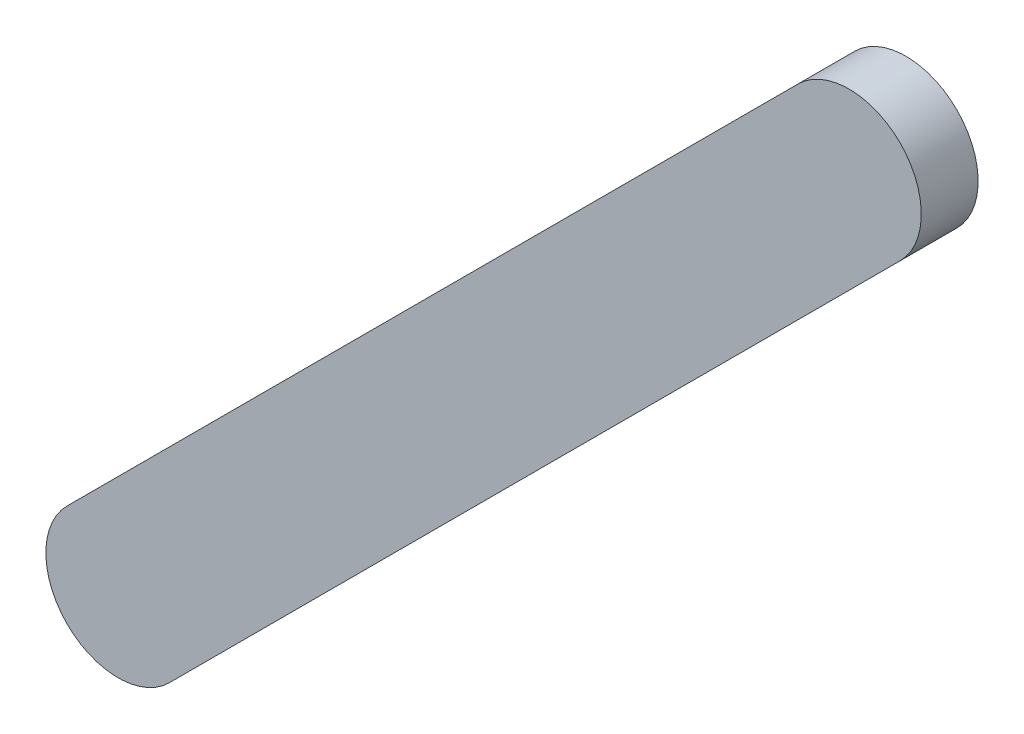
ISO-10303-21;
HEADER;
FILE_DESCRIPTION(('STEP AP214'),'2;1');
FILE_NAME('part.step','',(''),(''),'','','');
FILE_SCHEMA(('AUTOMOTIVE_DESIGN { 1 0 10303 214 1 1 1 1 }'));
ENDSEC;
DATA;
#1=APPLICATION_CONTEXT('core data for automotive mechanical design processes');
#2=APPLICATION_PROTOCOL_DEFINITION('international standard','automotive_design',2000,#1);
#3=PRODUCT_CONTEXT('',#1,'mechanical');
#4=PRODUCT('Part','Part','',(#3));
#5=PRODUCT_RELATED_PRODUCT_CATEGORY('part','',(#4));
#6=PRODUCT_DEFINITION_FORMATION('','',#4);
#7=PRODUCT_DEFINITION_CONTEXT('part definition',#1,'design');
#8=PRODUCT_DEFINITION('design','',#6,#7);
#9=PRODUCT_DEFINITION_SHAPE('','',#8);
#10=(LENGTH_UNIT() NAMED_UNIT(*) SI_UNIT(.MILLI.,.METRE.));
#11=(NAMED_UNIT(*) PLANE_ANGLE_UNIT() SI_UNIT($,.RADIAN.));
#12=(NAMED_UNIT(*) SI_UNIT($,.STERADIAN.) SOLID_ANGLE_UNIT());
#13=UNCERTAINTY_MEASURE_WITH_UNIT(LENGTH_MEASURE(1.E-05),#10,'distance_accuracy_value','');
#14=(GEOMETRIC_REPRESENTATION_CONTEXT(3) GLOBAL_UNCERTAINTY_ASSIGNED_CONTEXT((#13)) GLOBAL_UNIT_ASSIGNED_CONTEXT((#10,
#11,#12)) REPRESENTATION_CONTEXT('',''));
#15=CARTESIAN_POINT('',(0.,0.,0.));
#16=DIRECTION('',(0.,0.,1.));
#17=DIRECTION('',(1.,0.,0.));
#18=AXIS2_PLACEMENT_3D('',#15,#16,#17);
#19=CARTESIAN_POINT('',(139.59405914,83.12939686,0.));
#20=DIRECTION('',(-0.707106781186554,0.707106781186542,0.));
#21=DIRECTION('',(0.707106781186542,0.707106781186554,0.));
#22=AXIS2_PLACEMENT_3D('',#19,#20,#21);
#23=PLANE('',#22);
#24=DIRECTION('',(0.707106781186542,0.707106781186553,0.));
#25=VECTOR('',#24,1.);
#26=CARTESIAN_POINT('',(139.59405914,83.12939686,0.1999996));
#27=LINE('',#26,#25);
#28=CARTESIAN_POINT('',(139.59405914,83.12939686,0.1999996));
#29=VERTEX_POINT('',#28);
#30=CARTESIAN_POINT('',(142.16560594,85.70094366,0.1999996));
#31=VERTEX_POINT('',#30);
#32=EDGE_CURVE('E11',#29,#31,#27,.T.);
#33=ORIENTED_EDGE('',*,*,#32,.F.);
#34=DIRECTION('',(0.,0.,1.));
#35=VECTOR('',#34,1.);
#36=CARTESIAN_POINT('',(139.59405914,83.12939686,0.));
#37=LINE('',#36,#35);
#38=CARTESIAN_POINT('',(139.59405914,83.12939686,0.));
#39=VERTEX_POINT('',#38);
#40=EDGE_CURVE('E24',#39,#29,#37,.T.);
#41=ORIENTED_EDGE('',*,*,#40,.F.);
#42=DIRECTION('',(0.707106781186542,0.707106781186553,0.));
#43=VECTOR('',#42,1.);
#44=CARTESIAN_POINT('',(139.59405914,83.12939686,0.));
#45=LINE('',#44,#43);
#46=CARTESIAN_POINT('',(142.16560594,85.70094366,0.));
#47=VERTEX_POINT('',#46);
#48=EDGE_CURVE('E75',#39,#47,#45,.T.);
#49=ORIENTED_EDGE('',*,*,#48,.T.);
#50=DIRECTION('',(0.,0.,1.));
#51=VECTOR('',#50,1.);
#52=CARTESIAN_POINT('',(142.16560594,85.70094366,0.));
#53=LINE('',#52,#51);
#54=EDGE_CURVE('E37',#47,#31,#53,.T.);
#55=ORIENTED_EDGE('',*,*,#54,.T.);
#56=EDGE_LOOP('',(#33,#41,#49,#55));
#57=FACE_BOUND('',#56,.T.);
#58=ADVANCED_FACE('F17',(#57),#23,.F.);
#59=CARTESIAN_POINT('',(141.986,85.8805496,0.));
#60=DIRECTION('',(0.,0.,-1.));
#61=DIRECTION('',(0.707106781186548,-0.707106781186548,0.));
#62=AXIS2_PLACEMENT_3D('',#59,#60,#61);
#63=CYLINDRICAL_SURFACE('',#62,0.254001156230764);
#64=CARTESIAN_POINT('',(141.986,85.8805496,0.1999996));
#65=DIRECTION('',(0.,0.,1.));
#66=DIRECTION('',(0.707106781186548,-0.707106781186548,0.));
#67=AXIS2_PLACEMENT_3D('',#64,#65,#66);
#68=CIRCLE('',#67,0.254001156230764);
#69=CARTESIAN_POINT('',(141.80639406,86.06015554,0.1999996));
#70=VERTEX_POINT('',#69);
#71=EDGE_CURVE('E83',#31,#70,#68,.T.);
#72=ORIENTED_EDGE('',*,*,#71,.F.);
#73=ORIENTED_EDGE('',*,*,#54,.F.);
#74=CARTESIAN_POINT('',(141.986,85.8805496,0.));
#75=DIRECTION('',(0.,0.,1.));
#76=DIRECTION('',(0.707106781186548,-0.707106781186548,0.));
#77=AXIS2_PLACEMENT_3D('',#74,#75,#76);
#78=CIRCLE('',#77,0.254001156230764);
#79=CARTESIAN_POINT('',(141.80639406,86.06015554,0.));
#80=VERTEX_POINT('',#79);
#81=EDGE_CURVE('E81',#47,#80,#78,.T.);
#82=ORIENTED_EDGE('',*,*,#81,.T.);
#83=DIRECTION('',(0.,0.,1.));
#84=VECTOR('',#83,1.);
#85=CARTESIAN_POINT('',(141.80639406,86.06015554,0.));
#86=LINE('',#85,#84);
#87=EDGE_CURVE('E67',#80,#70,#86,.T.);
#88=ORIENTED_EDGE('',*,*,#87,.T.);
#89=EDGE_LOOP('',(#72,#73,#82,#88));
#90=FACE_BOUND('',#89,.T.);
#91=ADVANCED_FACE('F89',(#90),#63,.T.);
#92=CARTESIAN_POINT('',(141.80639406,86.06015554,0.));
#93=DIRECTION('',(0.707106781186554,-0.707106781186542,0.));
#94=DIRECTION('',(-0.707106781186542,-0.707106781186554,0.));
#95=AXIS2_PLACEMENT_3D('',#92,#93,#94);
#96=PLANE('',#95);
#97=DIRECTION('',(-0.707106781186542,-0.707106781186553,0.));
#98=VECTOR('',#97,1.);
#99=CARTESIAN_POINT('',(141.80639406,86.06015554,0.1999996));
#100=LINE('',#99,#98);
#101=CARTESIAN_POINT('',(139.23484726,83.48860874,0.1999996));
#102=VERTEX_POINT('',#101);
#103=EDGE_CURVE('E71',#70,#102,#100,.T.);
#104=ORIENTED_EDGE('',*,*,#103,.F.);
#105=ORIENTED_EDGE('',*,*,#87,.F.);
#106=DIRECTION('',(-0.707106781186542,-0.707106781186553,0.));
#107=VECTOR('',#106,1.);
#108=CARTESIAN_POINT('',(141.80639406,86.06015554,0.));
#109=LINE('',#108,#107);
#110=CARTESIAN_POINT('',(139.23484726,83.48860874,0.));
#111=VERTEX_POINT('',#110);
#112=EDGE_CURVE('E63',#80,#111,#109,.T.);
#113=ORIENTED_EDGE('',*,*,#112,.T.);
#114=DIRECTION('',(0.,0.,1.));
#115=VECTOR('',#114,1.);
#116=CARTESIAN_POINT('',(139.23484726,83.48860874,0.));
#117=LINE('',#116,#115);
#118=EDGE_CURVE('E53',#111,#102,#117,.T.);
#119=ORIENTED_EDGE('',*,*,#118,.T.);
#120=EDGE_LOOP('',(#104,#105,#113,#119));
#121=FACE_BOUND('',#120,.T.);
#122=ADVANCED_FACE('F66',(#121),#96,.F.);
#123=CARTESIAN_POINT('',(139.4144532,83.3090028,0.));
#124=DIRECTION('',(0.,0.,-1.));
#125=DIRECTION('',(-0.707106781186604,0.707106781186492,0.));
#126=AXIS2_PLACEMENT_3D('',#123,#124,#125);
#127=CYLINDRICAL_SURFACE('',#126,0.254001156230771);
#128=CARTESIAN_POINT('',(139.4144532,83.3090028,0.1999996));
#129=DIRECTION('',(0.,0.,1.));
#130=DIRECTION('',(-0.707106781186604,0.707106781186492,0.));
#131=AXIS2_PLACEMENT_3D('',#128,#129,#130);
#132=CIRCLE('',#131,0.254001156230771);
#133=EDGE_CURVE('E59',#102,#29,#132,.T.);
#134=ORIENTED_EDGE('',*,*,#133,.F.);
#135=ORIENTED_EDGE('',*,*,#118,.F.);
#136=CARTESIAN_POINT('',(139.4144532,83.3090028,0.));
#137=DIRECTION('',(0.,0.,1.));
#138=DIRECTION('',(-0.707106781186604,0.707106781186492,0.));
#139=AXIS2_PLACEMENT_3D('',#136,#137,#138);
#140=CIRCLE('',#139,0.254001156230771);
#141=EDGE_CURVE('E57',#111,#39,#140,.T.);
#142=ORIENTED_EDGE('',*,*,#141,.T.);
#143=ORIENTED_EDGE('',*,*,#40,.T.);
#144=EDGE_LOOP('',(#134,#135,#142,#143));
#145=FACE_BOUND('',#144,.T.);
#146=ADVANCED_FACE('F55',(#145),#127,.T.);
#147=CARTESIAN_POINT('',(139.59405914,83.12939686,0.));
#148=DIRECTION('',(0.,0.,-1.));
#149=DIRECTION('',(-1.,0.,0.));
#150=AXIS2_PLACEMENT_3D('',#147,#148,#149);
#151=PLANE('',#150);
#152=ORIENTED_EDGE('',*,*,#141,.F.);
#153=ORIENTED_EDGE('',*,*,#112,.F.);
#154=ORIENTED_EDGE('',*,*,#81,.F.);
#155=ORIENTED_EDGE('',*,*,#48,.F.);
#156=EDGE_LOOP('',(#152,#153,#154,#155));
#157=FACE_BOUND('',#156,.T.);
#158=ADVANCED_FACE('F74',(#157),#151,.T.);
#159=CARTESIAN_POINT('',(139.59405914,83.12939686,0.1999996));
#160=DIRECTION('',(0.,0.,-1.));
#161=DIRECTION('',(-1.,0.,0.));
#162=AXIS2_PLACEMENT_3D('',#159,#160,#161);
#163=PLANE('',#162);
#164=ORIENTED_EDGE('',*,*,#32,.T.);
#165=ORIENTED_EDGE('',*,*,#71,.T.);
#166=ORIENTED_EDGE('',*,*,#103,.T.);
#167=ORIENTED_EDGE('',*,*,#133,.T.);
#168=EDGE_LOOP('',(#164,#165,#166,#167));
#169=FACE_BOUND('',#168,.T.);
#170=ADVANCED_FACE('F91',(#169),#163,.F.);
#171=CLOSED_SHELL('',(#58,#91,#122,#146,#158,#170));
#172=MANIFOLD_SOLID_BREP('B1',#171);
#173=ADVANCED_BREP_SHAPE_REPRESENTATION('',(#18,#172),#14);
#174=SHAPE_DEFINITION_REPRESENTATION(#9,#173);
ENDSEC;
END-ISO-10303-21;
